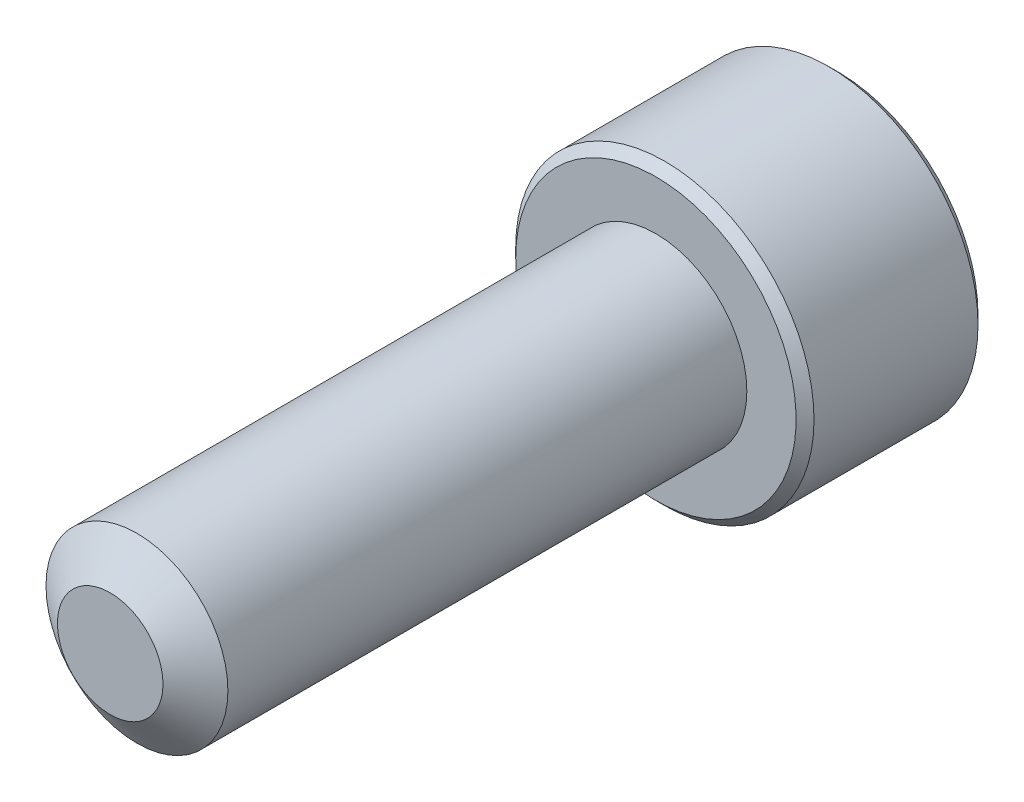
ISO-10303-21;
HEADER;
FILE_DESCRIPTION(('STEP AP214'),'2;1');
FILE_NAME('part.step','',(''),(''),'','','');
FILE_SCHEMA(('AUTOMOTIVE_DESIGN { 1 0 10303 214 1 1 1 1 }'));
ENDSEC;
DATA;
#1=APPLICATION_CONTEXT('core data for automotive mechanical design processes');
#2=APPLICATION_PROTOCOL_DEFINITION('international standard','automotive_design',2000,#1);
#3=PRODUCT_CONTEXT('',#1,'mechanical');
#4=PRODUCT('Part','Part','',(#3));
#5=PRODUCT_RELATED_PRODUCT_CATEGORY('part','',(#4));
#6=PRODUCT_DEFINITION_FORMATION('','',#4);
#7=PRODUCT_DEFINITION_CONTEXT('part definition',#1,'design');
#8=PRODUCT_DEFINITION('design','',#6,#7);
#9=PRODUCT_DEFINITION_SHAPE('','',#8);
#10=(LENGTH_UNIT() NAMED_UNIT(*) SI_UNIT(.MILLI.,.METRE.));
#11=(NAMED_UNIT(*) PLANE_ANGLE_UNIT() SI_UNIT($,.RADIAN.));
#12=(NAMED_UNIT(*) SI_UNIT($,.STERADIAN.) SOLID_ANGLE_UNIT());
#13=UNCERTAINTY_MEASURE_WITH_UNIT(LENGTH_MEASURE(1.E-05),#10,'distance_accuracy_value','');
#14=(GEOMETRIC_REPRESENTATION_CONTEXT(3) GLOBAL_UNCERTAINTY_ASSIGNED_CONTEXT((#13)) GLOBAL_UNIT_ASSIGNED_CONTEXT((#10,
#11,#12)) REPRESENTATION_CONTEXT('',''));
#15=CARTESIAN_POINT('',(0.,0.,0.));
#16=DIRECTION('',(0.,0.,1.));
#17=DIRECTION('',(1.,0.,0.));
#18=AXIS2_PLACEMENT_3D('',#15,#16,#17);
#19=CARTESIAN_POINT('',(0.,0.,-9.525));
#20=DIRECTION('',(0.,0.,1.));
#21=DIRECTION('',(1.,0.,0.));
#22=AXIS2_PLACEMENT_3D('',#19,#20,#21);
#23=CYLINDRICAL_SURFACE('',#22,1.5875);
#24=CARTESIAN_POINT('',(0.,0.,-9.525));
#25=DIRECTION('',(0.,0.,-1.));
#26=DIRECTION('',(-1.,0.,0.));
#27=AXIS2_PLACEMENT_3D('',#24,#25,#26);
#28=CIRCLE('',#27,1.5875);
#29=CARTESIAN_POINT('',(1.5875,0.,-9.525));
#30=VERTEX_POINT('',#29);
#31=EDGE_CURVE('E233',#30,#30,#28,.F.);
#32=CARTESIAN_POINT('',(0.,0.,-0.46664953170549));
#33=DIRECTION('',(0.,0.,1.));
#34=DIRECTION('',(1.,0.,0.));
#35=AXIS2_PLACEMENT_3D('',#32,#33,#34);
#36=CIRCLE('',#35,1.5875);
#37=CARTESIAN_POINT('',(1.5875,0.,-0.466649531705488));
#38=VERTEX_POINT('',#37);
#39=EDGE_CURVE('E118',#38,#38,#36,.T.);
#40=CARTESIAN_POINT('',(1.5875,0.,-9.525));
#41=CARTESIAN_POINT('',(1.5875,0.,-9.43064218262193));
#42=CARTESIAN_POINT('',(1.5875,0.,-9.33628436524386));
#43=CARTESIAN_POINT('',(1.5875,0.,-9.14756873048773));
#44=CARTESIAN_POINT('',(1.5875,0.,-9.05321091310966));
#45=CARTESIAN_POINT('',(1.5875,0.,-8.86449527835352));
#46=CARTESIAN_POINT('',(1.5875,0.,-8.77013746097546));
#47=CARTESIAN_POINT('',(1.5875,0.,-8.58142182621932));
#48=CARTESIAN_POINT('',(1.5875,0.,-8.48706400884125));
#49=CARTESIAN_POINT('',(1.5875,0.,-8.29834837408512));
#50=CARTESIAN_POINT('',(1.5875,0.,-8.20399055670705));
#51=CARTESIAN_POINT('',(1.5875,0.,-8.01527492195091));
#52=CARTESIAN_POINT('',(1.5875,0.,-7.92091710457285));
#53=CARTESIAN_POINT('',(1.5875,0.,-7.73220146981671));
#54=CARTESIAN_POINT('',(1.5875,0.,-7.63784365243864));
#55=CARTESIAN_POINT('',(1.5875,0.,-7.44912801768251));
#56=CARTESIAN_POINT('',(1.5875,0.,-7.35477020030444));
#57=CARTESIAN_POINT('',(1.5875,0.,-7.1660545655483));
#58=CARTESIAN_POINT('',(1.5875,0.,-7.07169674817024));
#59=CARTESIAN_POINT('',(1.5875,0.,-6.8829811134141));
#60=CARTESIAN_POINT('',(1.5875,0.,-6.78862329603603));
#61=CARTESIAN_POINT('',(1.5875,0.,-6.5999076612799));
#62=CARTESIAN_POINT('',(1.5875,0.,-6.50554984390183));
#63=CARTESIAN_POINT('',(1.5875,0.,-6.31683420914569));
#64=CARTESIAN_POINT('',(1.5875,0.,-6.22247639176763));
#65=CARTESIAN_POINT('',(1.5875,0.,-6.03376075701149));
#66=CARTESIAN_POINT('',(1.5875,0.,-5.93940293963342));
#67=CARTESIAN_POINT('',(1.5875,0.,-5.75068730487729));
#68=CARTESIAN_POINT('',(1.5875,0.,-5.65632948749922));
#69=CARTESIAN_POINT('',(1.5875,0.,-5.46761385274308));
#70=CARTESIAN_POINT('',(1.5875,0.,-5.37325603536502));
#71=CARTESIAN_POINT('',(1.5875,0.,-5.18454040060888));
#72=CARTESIAN_POINT('',(1.5875,0.,-5.09018258323081));
#73=CARTESIAN_POINT('',(1.5875,0.,-4.90146694847468));
#74=CARTESIAN_POINT('',(1.5875,0.,-4.80710913109661));
#75=CARTESIAN_POINT('',(1.5875,0.,-4.61839349634047));
#76=CARTESIAN_POINT('',(1.5875,0.,-4.5240356789624));
#77=CARTESIAN_POINT('',(1.5875,0.,-4.33532004420627));
#78=CARTESIAN_POINT('',(1.5875,0.,-4.2409622268282));
#79=CARTESIAN_POINT('',(1.5875,0.,-4.05224659207207));
#80=CARTESIAN_POINT('',(1.5875,0.,-3.957888774694));
#81=CARTESIAN_POINT('',(1.5875,0.,-3.76917313993786));
#82=CARTESIAN_POINT('',(1.5875,0.,-3.67481532255979));
#83=CARTESIAN_POINT('',(1.5875,0.,-3.48609968780366));
#84=CARTESIAN_POINT('',(1.5875,0.,-3.39174187042559));
#85=CARTESIAN_POINT('',(1.5875,0.,-3.20302623566946));
#86=CARTESIAN_POINT('',(1.5875,0.,-3.10866841829139));
#87=CARTESIAN_POINT('',(1.5875,0.,-2.91995278353525));
#88=CARTESIAN_POINT('',(1.5875,0.,-2.82559496615718));
#89=CARTESIAN_POINT('',(1.5875,0.,-2.63687933140105));
#90=CARTESIAN_POINT('',(1.5875,0.,-2.54252151402298));
#91=CARTESIAN_POINT('',(1.5875,0.,-2.35380587926684));
#92=CARTESIAN_POINT('',(1.5875,0.,-2.25944806188878));
#93=CARTESIAN_POINT('',(1.5875,0.,-2.07073242713264));
#94=CARTESIAN_POINT('',(1.5875,0.,-1.97637460975457));
#95=CARTESIAN_POINT('',(1.5875,0.,-1.78765897499844));
#96=CARTESIAN_POINT('',(1.5875,0.,-1.69330115762037));
#97=CARTESIAN_POINT('',(1.5875,0.,-1.50458552286423));
#98=CARTESIAN_POINT('',(1.5875,0.,-1.41022770548617));
#99=CARTESIAN_POINT('',(1.5875,0.,-1.22151207073003));
#100=CARTESIAN_POINT('',(1.5875,0.,-1.12715425335196));
#101=CARTESIAN_POINT('',(1.5875,0.,-0.938438618595827));
#102=CARTESIAN_POINT('',(1.5875,0.,-0.844080801217759));
#103=CARTESIAN_POINT('',(1.5875,0.,-0.655365166461624));
#104=CARTESIAN_POINT('',(1.5875,0.,-0.561007349083556));
#105=CARTESIAN_POINT('',(1.5875,0.,-0.466649531705488));
#106=B_SPLINE_CURVE_WITH_KNOTS('',3,(#40,#41,#42,#43,#44,#45,#46,#47,#48,#49,#50,#51,#52,#53,
#54,#55,#56,#57,#58,#59,#60,#61,#62,#63,#64,#65,#66,#67,#68,#69,#70,#71,#72,#73,#74,#75,#76,#77,
#78,#79,#80,#81,#82,#83,#84,#85,#86,#87,#88,#89,#90,#91,#92,#93,#94,#95,#96,#97,#98,#99,#100,
#101,#102,#103,#104,#105),.UNSPECIFIED.,.F.,.F.,(4,2,2,2,2,2,2,2,2,2,2,2,2,2,2,2,2,2,2,2,2,2,2,
2,2,2,2,2,2,2,2,2,4),(0.,0.283073452134203,0.566146904268407,0.84922035640261,1.13229380853681,
1.41536726067102,1.69844071280522,1.98151416493942,2.26458761707363,2.54766106920783,
2.83073452134203,3.11380797347624,3.39688142561044,3.67995487774464,3.96302832987885,
4.24610178201305,4.52917523414725,4.81224868628146,5.09532213841566,5.37839559054987,
5.66146904268407,5.94454249481827,6.22761594695248,6.51068939908668,6.79376285122088,
7.07683630335509,7.35990975548929,7.64298320762349,7.9260566597577,8.2091301118919,
8.4922035640261,8.77527701616031,9.05835046829451),.UNSPECIFIED.);
#107=EDGE_CURVE('BSEAM41',#30,#38,#106,.T.);
#108=ORIENTED_EDGE('',*,*,#31,.T.);
#109=ORIENTED_EDGE('',*,*,#39,.F.);
#110=ORIENTED_EDGE('',*,*,#107,.T.);
#111=ORIENTED_EDGE('',*,*,#107,.F.);
#112=EDGE_LOOP('',(#108,#110,#109,#111));
#113=FACE_BOUND('',#112,.T.);
#114=ADVANCED_FACE('F41',(#113),#23,.T.);
#115=CARTESIAN_POINT('',(0.,0.,0.));
#116=DIRECTION('',(0.,0.,-1.));
#117=DIRECTION('',(-1.,0.,0.));
#118=AXIS2_PLACEMENT_3D('',#115,#116,#117);
#119=CONICAL_SURFACE('',#118,0.92105540144766,0.959931088596884);
#120=ORIENTED_EDGE('',*,*,#39,.T.);
#121=EDGE_LOOP('',(#120));
#122=FACE_BOUND('',#121,.T.);
#123=CARTESIAN_POINT('',(0.,0.,0.));
#124=DIRECTION('',(0.,0.,1.));
#125=DIRECTION('',(1.,0.,0.));
#126=AXIS2_PLACEMENT_3D('',#123,#124,#125);
#127=CIRCLE('',#126,0.92105540144766);
#128=CARTESIAN_POINT('',(0.92105540144766,0.,0.));
#129=VERTEX_POINT('',#128);
#130=EDGE_CURVE('E230',#129,#129,#127,.T.);
#131=ORIENTED_EDGE('',*,*,#130,.F.);
#132=EDGE_LOOP('',(#131));
#133=FACE_BOUND('',#132,.T.);
#134=ADVANCED_FACE('F213',(#122,#133),#119,.T.);
#135=CARTESIAN_POINT('',(0.,0.,0.));
#136=DIRECTION('',(0.,0.,1.));
#137=DIRECTION('',(1.,0.,0.));
#138=AXIS2_PLACEMENT_3D('',#135,#136,#137);
#139=PLANE('',#138);
#140=ORIENTED_EDGE('',*,*,#130,.T.);
#141=EDGE_LOOP('',(#140));
#142=FACE_BOUND('',#141,.T.);
#143=ADVANCED_FACE('F210',(#142),#139,.T.);
#144=CARTESIAN_POINT('',(0.,0.,-12.7));
#145=DIRECTION('',(0.,0.,1.));
#146=DIRECTION('',(1.,0.,0.));
#147=AXIS2_PLACEMENT_3D('',#144,#145,#146);
#148=CYLINDRICAL_SURFACE('',#147,2.6035);
#149=CARTESIAN_POINT('',(0.,0.,-12.54379));
#150=DIRECTION('',(0.,0.,-1.));
#151=DIRECTION('',(-1.,0.,0.));
#152=AXIS2_PLACEMENT_3D('',#149,#150,#151);
#153=CIRCLE('',#152,2.6035);
#154=CARTESIAN_POINT('',(2.6035,0.,-12.54379));
#155=VERTEX_POINT('',#154);
#156=EDGE_CURVE('E50',#155,#155,#153,.F.);
#157=ORIENTED_EDGE('',*,*,#156,.T.);
#158=EDGE_LOOP('',(#157));
#159=FACE_BOUND('',#158,.T.);
#160=CARTESIAN_POINT('',(0.,0.,-9.68121));
#161=DIRECTION('',(0.,0.,-1.));
#162=DIRECTION('',(-1.,0.,0.));
#163=AXIS2_PLACEMENT_3D('',#160,#161,#162);
#164=CIRCLE('',#163,2.6035);
#165=CARTESIAN_POINT('',(-2.6035,0.,-9.68121));
#166=VERTEX_POINT('',#165);
#167=EDGE_CURVE('E187',#166,#166,#164,.T.);
#168=ORIENTED_EDGE('',*,*,#167,.T.);
#169=EDGE_LOOP('',(#168));
#170=FACE_BOUND('',#169,.T.);
#171=ADVANCED_FACE('F194',(#159,#170),#148,.T.);
#172=CARTESIAN_POINT('',(0.,0.,-12.7));
#173=DIRECTION('',(0.,0.,-1.));
#174=DIRECTION('',(-1.,0.,0.));
#175=AXIS2_PLACEMENT_3D('',#172,#173,#174);
#176=PLANE('',#175);
#177=CARTESIAN_POINT('',(0.,0.,-12.7));
#178=DIRECTION('',(0.,0.,-1.));
#179=DIRECTION('',(-1.,0.,0.));
#180=AXIS2_PLACEMENT_3D('',#177,#178,#179);
#181=CIRCLE('',#180,2.44729);
#182=CARTESIAN_POINT('',(2.44729,0.,-12.7));
#183=VERTEX_POINT('',#182);
#184=EDGE_CURVE('E117',#183,#183,#181,.T.);
#185=ORIENTED_EDGE('',*,*,#184,.T.);
#186=EDGE_LOOP('',(#185));
#187=FACE_BOUND('',#186,.T.);
#188=CARTESIAN_POINT('',(0.,0.,-12.7));
#189=DIRECTION('',(0.,0.,-1.));
#190=DIRECTION('',(-1.,0.,0.));
#191=AXIS2_PLACEMENT_3D('',#188,#189,#190);
#192=CIRCLE('',#191,1.3748153285078);
#193=CARTESIAN_POINT('',(-1.190625,0.687407664253902,-12.7));
#194=VERTEX_POINT('',#193);
#195=CARTESIAN_POINT('',(0.,1.3748153285078,-12.7));
#196=VERTEX_POINT('',#195);
#197=EDGE_CURVE('E96',#194,#196,#192,.T.);
#198=ORIENTED_EDGE('',*,*,#197,.F.);
#199=CARTESIAN_POINT('',(-1.190625,-0.687407664253902,-12.7));
#200=VERTEX_POINT('',#199);
#201=EDGE_CURVE('E56',#200,#194,#192,.T.);
#202=ORIENTED_EDGE('',*,*,#201,.F.);
#203=CARTESIAN_POINT('',(0.,-1.3748153285078,-12.7));
#204=VERTEX_POINT('',#203);
#205=EDGE_CURVE('E306',#204,#200,#192,.T.);
#206=ORIENTED_EDGE('',*,*,#205,.F.);
#207=CARTESIAN_POINT('',(1.190625,-0.6874076642539,-12.7));
#208=VERTEX_POINT('',#207);
#209=EDGE_CURVE('E63',#208,#204,#192,.T.);
#210=ORIENTED_EDGE('',*,*,#209,.F.);
#211=CARTESIAN_POINT('',(1.190625,0.687407664253901,-12.7));
#212=VERTEX_POINT('',#211);
#213=EDGE_CURVE('E141',#212,#208,#192,.T.);
#214=ORIENTED_EDGE('',*,*,#213,.F.);
#215=EDGE_CURVE('E106',#196,#212,#192,.T.);
#216=ORIENTED_EDGE('',*,*,#215,.F.);
#217=EDGE_LOOP('',(#198,#202,#206,#210,#214,#216));
#218=FACE_BOUND('',#217,.T.);
#219=ADVANCED_FACE('F140',(#187,#218),#176,.T.);
#220=CARTESIAN_POINT('',(0.,0.,-9.525));
#221=DIRECTION('',(0.,0.,-1.));
#222=DIRECTION('',(-1.,0.,0.));
#223=AXIS2_PLACEMENT_3D('',#220,#221,#222);
#224=PLANE('',#223);
#225=CARTESIAN_POINT('',(0.,0.,-9.525));
#226=DIRECTION('',(0.,0.,-1.));
#227=DIRECTION('',(-1.,0.,0.));
#228=AXIS2_PLACEMENT_3D('',#225,#226,#227);
#229=CIRCLE('',#228,2.44729);
#230=CARTESIAN_POINT('',(-2.44729,0.,-9.525));
#231=VERTEX_POINT('',#230);
#232=EDGE_CURVE('E11',#231,#231,#229,.F.);
#233=ORIENTED_EDGE('',*,*,#232,.T.);
#234=EDGE_LOOP('',(#233));
#235=FACE_BOUND('',#234,.T.);
#236=ORIENTED_EDGE('',*,*,#31,.F.);
#237=EDGE_LOOP('',(#236));
#238=FACE_BOUND('',#237,.T.);
#239=ADVANCED_FACE('F203',(#235,#238),#224,.F.);
#240=CARTESIAN_POINT('',(0.,0.,-12.7));
#241=DIRECTION('',(0.,0.,-1.));
#242=DIRECTION('',(-1.,0.,0.));
#243=AXIS2_PLACEMENT_3D('',#240,#241,#242);
#244=CONICAL_SURFACE('',#243,1.3748153285078,0.78539816339745);
#245=ORIENTED_EDGE('',*,*,#215,.T.);
#246=CARTESIAN_POINT('',(-0.000199999999998361,1.37493079856163,-12.7001154846));
#247=CARTESIAN_POINT('',(0.0407344195898574,1.35129730039231,-12.6764987642143));
#248=CARTESIAN_POINT('',(0.0823533883019748,1.32726857760297,-12.6542687817231));
#249=CARTESIAN_POINT('',(0.167219443673633,1.27827113768908,-12.6135656626274));
#250=CARTESIAN_POINT('',(0.210474607290961,1.25329775733078,-12.5951151826476));
#251=CARTESIAN_POINT('',(0.297696647457425,1.2029400889614,-12.5635088380043));
#252=CARTESIAN_POINT('',(0.341641294957926,1.17756863489755,-12.5502735042433));
#253=CARTESIAN_POINT('',(0.430498374163694,1.12626697629869,-12.5298814515754));
#254=CARTESIAN_POINT('',(0.475408088834755,1.10033834044413,-12.522709502896));
#255=CARTESIAN_POINT('',(0.552804127656978,1.0556537165959,-12.5162385386489));
#256=CARTESIAN_POINT('',(0.585190412515647,1.0369554863147,-12.5152803201468));
#257=CARTESIAN_POINT('',(0.64990607331777,0.99959188212981,-12.5168926490721));
#258=CARTESIAN_POINT('',(0.682235435127273,0.980926516386365,-12.5194639751796));
#259=CARTESIAN_POINT('',(0.746582156071485,0.943775919727754,-12.5279867539936));
#260=CARTESIAN_POINT('',(0.778599196336768,0.925290872911938,-12.5339413547526));
#261=CARTESIAN_POINT('',(0.842098763396457,0.888629380776601,-12.5489099640712));
#262=CARTESIAN_POINT('',(0.873581054644164,0.870453071450031,-12.5579252859121));
#263=CARTESIAN_POINT('',(0.954214838572127,0.823899134593444,-12.584682295838));
#264=CARTESIAN_POINT('',(1.00285783526766,0.79581508735709,-12.604436814436));
#265=CARTESIAN_POINT('',(1.09823941635212,0.740746505842245,-12.6489367689577));
#266=CARTESIAN_POINT('',(1.14498361758715,0.713758728676142,-12.6736659647162));
#267=CARTESIAN_POINT('',(1.190825,0.687292194200062,-12.7001154846));
#268=B_SPLINE_CURVE_WITH_KNOTS('',3,(#246,#247,#248,#249,#250,#251,#252,#253,#254,#255,#256,
#257,#258,#259,#260,#261,#262,#263,#264,#265,#266,#267),.UNSPECIFIED.,.F.,.F.,(4,2,2,2,2,2,2,2,
2,2,4),(0.,0.15862567293412,0.318176079843269,0.475191357500654,0.631811068630747,
0.743878551794716,0.855970763007027,0.96816744442324,1.08041232768376,1.25873351645467,
1.43648174479846),.UNSPECIFIED.);
#269=EDGE_CURVE('E111',#196,#212,#268,.T.);
#270=ORIENTED_EDGE('',*,*,#269,.F.);
#271=EDGE_LOOP('',(#245,#270));
#272=FACE_BOUND('',#271,.T.);
#273=ADVANCED_FACE('F112',(#272),#244,.F.);
#274=ORIENTED_EDGE('',*,*,#213,.T.);
#275=CARTESIAN_POINT('',(1.190625,-1.37097145294693,-13.1409904472899));
#276=CARTESIAN_POINT('',(1.190625,-1.3375892063789,-13.1157899888078));
#277=CARTESIAN_POINT('',(1.190625,-1.30402095496658,-13.0908366202374));
#278=CARTESIAN_POINT('',(1.190625,-1.23643692297761,-13.0415260871772));
#279=CARTESIAN_POINT('',(1.190625,-1.20242103219112,-13.0171690738994));
#280=CARTESIAN_POINT('',(1.190625,-1.09909081482554,-12.9447982089892));
#281=CARTESIAN_POINT('',(1.190625,-1.02900143506767,-12.8978726225956));
#282=CARTESIAN_POINT('',(1.190625,-0.882026737424229,-12.8057521033256));
#283=CARTESIAN_POINT('',(1.190625,-0.804981866019981,-12.7608088372421));
#284=CARTESIAN_POINT('',(1.190625,-0.647043893307966,-12.6785980245069));
#285=CARTESIAN_POINT('',(1.190625,-0.566164943702922,-12.6413046017321));
#286=CARTESIAN_POINT('',(1.190625,-0.444764933868857,-12.5956795555631));
#287=CARTESIAN_POINT('',(1.190625,-0.406041211486715,-12.5825848390215));
#288=CARTESIAN_POINT('',(1.190625,-0.327658904711934,-12.5595042758966));
#289=CARTESIAN_POINT('',(1.190625,-0.288000256118253,-12.549518643486));
#290=CARTESIAN_POINT('',(1.190625,-0.208647693212098,-12.5333412290653));
#291=CARTESIAN_POINT('',(1.190625,-0.168967240621963,-12.527084445849));
#292=CARTESIAN_POINT('',(1.190625,-0.0891819742965345,-12.5184868884185));
#293=CARTESIAN_POINT('',(1.190625,-0.0490772347013136,-12.5161454410499));
#294=CARTESIAN_POINT('',(1.190625,0.0297075773931752,-12.5155522440677));
#295=CARTESIAN_POINT('',(1.190625,0.0683866068288072,-12.517155353796));
#296=CARTESIAN_POINT('',(1.190625,0.145416876633149,-12.5240430277445));
#297=CARTESIAN_POINT('',(1.190625,0.183768052740677,-12.5293282976685));
#298=CARTESIAN_POINT('',(1.190625,0.260508634904942,-12.5433814122329));
#299=CARTESIAN_POINT('',(1.190625,0.29888705203913,-12.5522083626058));
#300=CARTESIAN_POINT('',(1.190625,0.374805334250661,-12.5728757099806));
#301=CARTESIAN_POINT('',(1.190625,0.412345269207092,-12.5847158548359));
#302=CARTESIAN_POINT('',(1.190625,0.530535580908836,-12.6264473336672));
#303=CARTESIAN_POINT('',(1.190625,0.609503725744443,-12.6610913969143));
#304=CARTESIAN_POINT('',(1.190625,0.763730269113462,-12.7381182519749));
#305=CARTESIAN_POINT('',(1.190625,0.838974064674601,-12.7805288466687));
#306=CARTESIAN_POINT('',(1.190625,0.982775796189614,-12.868025645025));
#307=CARTESIAN_POINT('',(1.190625,1.05148016607044,-12.9128741620552));
#308=CARTESIAN_POINT('',(1.190625,1.15270222256253,-12.9822053299226));
#309=CARTESIAN_POINT('',(1.190625,1.18600604145834,-13.0055601763372));
#310=CARTESIAN_POINT('',(1.190625,1.25215860362231,-13.0528875690193));
#311=CARTESIAN_POINT('',(1.190625,1.28500746868278,-13.0768599448583));
#312=CARTESIAN_POINT('',(1.190625,1.31766689427973,-13.1010883667713));
#313=B_SPLINE_CURVE_WITH_KNOTS('',3,(#275,#276,#277,#278,#279,#280,#281,#282,#283,#284,#285,
#286,#287,#288,#289,#290,#291,#292,#293,#294,#295,#296,#297,#298,#299,#300,#301,#302,#303,#304,
#305,#306,#307,#308,#309,#310,#311,#312),.UNSPECIFIED.,.F.,.F.,(4,2,2,2,2,2,2,2,2,2,2,2,2,2,2,2,
2,2,4),(0.,0.125475644763329,0.250982782413966,0.503912518769173,0.771279184643222,
1.03772598255657,1.16025581644629,1.28279408906665,1.40312855503246,1.5234423300503,
1.63939577664876,1.75537145240477,1.87336894094838,1.99135655861152,2.24929724983448,
2.50818004711562,2.75419821472196,2.87622362118596,2.9982157038896),.UNSPECIFIED.);
#314=EDGE_CURVE('E105',#212,#208,#313,.F.);
#315=ORIENTED_EDGE('',*,*,#314,.F.);
#316=EDGE_LOOP('',(#274,#315));
#317=FACE_BOUND('',#316,.T.);
#318=ADVANCED_FACE('F317',(#317),#244,.F.);
#319=ORIENTED_EDGE('',*,*,#209,.T.);
#320=CARTESIAN_POINT('',(1.190825,-0.687292194200062,-12.7001154846));
#321=CARTESIAN_POINT('',(1.14989058041014,-0.710925692369387,-12.6764987642143));
#322=CARTESIAN_POINT('',(1.10827161169802,-0.734954415158722,-12.6542687817231));
#323=CARTESIAN_POINT('',(1.02340555632637,-0.783951855072611,-12.6135656626274));
#324=CARTESIAN_POINT('',(0.980150392709038,-0.808925235430917,-12.5951151826476));
#325=CARTESIAN_POINT('',(0.892928352542574,-0.859282903800292,-12.5635088380043));
#326=CARTESIAN_POINT('',(0.848983705042073,-0.88465435786415,-12.5502735042433));
#327=CARTESIAN_POINT('',(0.760126625836305,-0.935956016463004,-12.5298814515754));
#328=CARTESIAN_POINT('',(0.715216911165244,-0.96188465231757,-12.522709502896));
#329=CARTESIAN_POINT('',(0.637820872343021,-1.00656927616579,-12.5162385386489));
#330=CARTESIAN_POINT('',(0.605434587484353,-1.025267506447,-12.5152803201468));
#331=CARTESIAN_POINT('',(0.54071892668223,-1.06263111063189,-12.5168926490721));
#332=CARTESIAN_POINT('',(0.508389564872727,-1.08129647637533,-12.5194639751796));
#333=CARTESIAN_POINT('',(0.444042843928515,-1.11844707303394,-12.5279867539936));
#334=CARTESIAN_POINT('',(0.412025803663232,-1.13693211984976,-12.5339413547526));
#335=CARTESIAN_POINT('',(0.348526236603542,-1.17359361198509,-12.5489099640712));
#336=CARTESIAN_POINT('',(0.317043945355835,-1.19176992131166,-12.5579252859121));
#337=CARTESIAN_POINT('',(0.236410161427873,-1.23832385816825,-12.584682295838));
#338=CARTESIAN_POINT('',(0.187767164732342,-1.26640790540461,-12.604436814436));
#339=CARTESIAN_POINT('',(0.0923855836478808,-1.32147648691945,-12.6489367689577));
#340=CARTESIAN_POINT('',(0.0456413824128441,-1.34846426408556,-12.6736659647162));
#341=CARTESIAN_POINT('',(-0.00020000000000049,-1.37493079856164,-12.7001154846));
#342=B_SPLINE_CURVE_WITH_KNOTS('',3,(#320,#321,#322,#323,#324,#325,#326,#327,#328,#329,#330,
#331,#332,#333,#334,#335,#336,#337,#338,#339,#340,#341),.UNSPECIFIED.,.F.,.F.,(4,2,2,2,2,2,2,2,
2,2,4),(0.,0.15862567293412,0.31817607984327,0.475191357500654,0.631811068630746,
0.743878551794716,0.855970763007027,0.96816744442324,1.08041232768376,1.25873351645467,
1.43648174479847),.UNSPECIFIED.);
#343=EDGE_CURVE('E154',#208,#204,#342,.T.);
#344=ORIENTED_EDGE('',*,*,#343,.F.);
#345=EDGE_LOOP('',(#319,#344));
#346=FACE_BOUND('',#345,.T.);
#347=ADVANCED_FACE('F314',(#346),#244,.F.);
#348=ORIENTED_EDGE('',*,*,#205,.T.);
#349=CARTESIAN_POINT('',(0.000199999999999274,-1.37493079856164,-12.7001154846));
#350=CARTESIAN_POINT('',(-0.0407344195898569,-1.35129730039231,-12.6764987642143));
#351=CARTESIAN_POINT('',(-0.0823533883019743,-1.32726857760298,-12.6542687817231));
#352=CARTESIAN_POINT('',(-0.167219443673633,-1.27827113768909,-12.6135656626274));
#353=CARTESIAN_POINT('',(-0.210474607290961,-1.25329775733078,-12.5951151826476));
#354=CARTESIAN_POINT('',(-0.297696647457425,-1.20294008896141,-12.5635088380043));
#355=CARTESIAN_POINT('',(-0.341641294957926,-1.17756863489755,-12.5502735042433));
#356=CARTESIAN_POINT('',(-0.430498374163694,-1.12626697629869,-12.5298814515754));
#357=CARTESIAN_POINT('',(-0.475408088834756,-1.10033834044413,-12.522709502896));
#358=CARTESIAN_POINT('',(-0.55280412765698,-1.05565371659591,-12.5162385386489));
#359=CARTESIAN_POINT('',(-0.585190412515648,-1.0369554863147,-12.5152803201468));
#360=CARTESIAN_POINT('',(-0.649906073317771,-0.99959188212981,-12.5168926490721));
#361=CARTESIAN_POINT('',(-0.682235435127274,-0.980926516386365,-12.5194639751796));
#362=CARTESIAN_POINT('',(-0.746582156071486,-0.943775919727755,-12.5279867539936));
#363=CARTESIAN_POINT('',(-0.77859919633677,-0.925290872911938,-12.5339413547526));
#364=CARTESIAN_POINT('',(-0.842098763396459,-0.888629380776602,-12.5489099640712));
#365=CARTESIAN_POINT('',(-0.873581054644166,-0.870453071450032,-12.5579252859121));
#366=CARTESIAN_POINT('',(-0.954214838572127,-0.823899134593445,-12.584682295838));
#367=CARTESIAN_POINT('',(-1.00285783526766,-0.795815087357091,-12.604436814436));
#368=CARTESIAN_POINT('',(-1.09823941635212,-0.740746505842247,-12.6489367689577));
#369=CARTESIAN_POINT('',(-1.14498361758715,-0.713758728676145,-12.6736659647162));
#370=CARTESIAN_POINT('',(-1.190825,-0.687292194200065,-12.7001154846));
#371=B_SPLINE_CURVE_WITH_KNOTS('',3,(#349,#350,#351,#352,#353,#354,#355,#356,#357,#358,#359,
#360,#361,#362,#363,#364,#365,#366,#367,#368,#369,#370),.UNSPECIFIED.,.F.,.F.,(4,2,2,2,2,2,2,2,
2,2,4),(0.,0.158625672934119,0.31817607984327,0.475191357500655,0.631811068630749,
0.743878551794719,0.85597076300703,0.968167444423243,1.08041232768377,1.25873351645467,
1.43648174479846),.UNSPECIFIED.);
#372=EDGE_CURVE('E283',#204,#200,#371,.T.);
#373=ORIENTED_EDGE('',*,*,#372,.F.);
#374=EDGE_LOOP('',(#348,#373));
#375=FACE_BOUND('',#374,.T.);
#376=ADVANCED_FACE('F311',(#375),#244,.F.);
#377=ORIENTED_EDGE('',*,*,#201,.T.);
#378=CARTESIAN_POINT('',(-1.190625,-1.37097145294694,-13.1409904472899));
#379=CARTESIAN_POINT('',(-1.190625,-1.33758920637891,-13.1157899888078));
#380=CARTESIAN_POINT('',(-1.190625,-1.30402095496659,-13.0908366202375));
#381=CARTESIAN_POINT('',(-1.190625,-1.23643692297762,-13.0415260871772));
#382=CARTESIAN_POINT('',(-1.190625,-1.20242103219113,-13.0171690738994));
#383=CARTESIAN_POINT('',(-1.190625,-1.09909081482555,-12.9447982089892));
#384=CARTESIAN_POINT('',(-1.190625,-1.02900143506767,-12.8978726225956));
#385=CARTESIAN_POINT('',(-1.190625,-0.882026737424234,-12.8057521033256));
#386=CARTESIAN_POINT('',(-1.190625,-0.804981866019986,-12.7608088372421));
#387=CARTESIAN_POINT('',(-1.190625,-0.647043893307969,-12.6785980245069));
#388=CARTESIAN_POINT('',(-1.190625,-0.566164943702924,-12.6413046017321));
#389=CARTESIAN_POINT('',(-1.190625,-0.444764933868859,-12.5956795555631));
#390=CARTESIAN_POINT('',(-1.190625,-0.406041211486716,-12.5825848390215));
#391=CARTESIAN_POINT('',(-1.190625,-0.327658904711936,-12.5595042758966));
#392=CARTESIAN_POINT('',(-1.190625,-0.288000256118255,-12.549518643486));
#393=CARTESIAN_POINT('',(-1.190625,-0.208647693212099,-12.5333412290653));
#394=CARTESIAN_POINT('',(-1.190625,-0.168967240621964,-12.527084445849));
#395=CARTESIAN_POINT('',(-1.190625,-0.0891819742965357,-12.5184868884185));
#396=CARTESIAN_POINT('',(-1.190625,-0.0490772347013147,-12.5161454410499));
#397=CARTESIAN_POINT('',(-1.190625,0.0297075773931742,-12.5155522440676));
#398=CARTESIAN_POINT('',(-1.190625,0.0683866068288064,-12.517155353796));
#399=CARTESIAN_POINT('',(-1.190625,0.145416876633148,-12.5240430277445));
#400=CARTESIAN_POINT('',(-1.190625,0.183768052740676,-12.5293282976685));
#401=CARTESIAN_POINT('',(-1.190625,0.260508634904942,-12.5433814122329));
#402=CARTESIAN_POINT('',(-1.190625,0.29888705203913,-12.5522083626058));
#403=CARTESIAN_POINT('',(-1.190625,0.374805334250661,-12.5728757099806));
#404=CARTESIAN_POINT('',(-1.190625,0.412345269207092,-12.5847158548359));
#405=CARTESIAN_POINT('',(-1.190625,0.530535580908837,-12.6264473336672));
#406=CARTESIAN_POINT('',(-1.190625,0.609503725744445,-12.6610913969143));
#407=CARTESIAN_POINT('',(-1.190625,0.763730269113464,-12.7381182519749));
#408=CARTESIAN_POINT('',(-1.190625,0.838974064674603,-12.7805288466687));
#409=CARTESIAN_POINT('',(-1.190625,0.982775796189615,-12.868025645025));
#410=CARTESIAN_POINT('',(-1.190625,1.05148016607044,-12.9128741620552));
#411=CARTESIAN_POINT('',(-1.190625,1.15270222256253,-12.9822053299226));
#412=CARTESIAN_POINT('',(-1.190625,1.18600604145833,-13.0055601763372));
#413=CARTESIAN_POINT('',(-1.190625,1.25215860362231,-13.0528875690193));
#414=CARTESIAN_POINT('',(-1.190625,1.28500746868278,-13.0768599448583));
#415=CARTESIAN_POINT('',(-1.190625,1.31766689427973,-13.1010883667712));
#416=B_SPLINE_CURVE_WITH_KNOTS('',3,(#378,#379,#380,#381,#382,#383,#384,#385,#386,#387,#388,
#389,#390,#391,#392,#393,#394,#395,#396,#397,#398,#399,#400,#401,#402,#403,#404,#405,#406,#407,
#408,#409,#410,#411,#412,#413,#414,#415),.UNSPECIFIED.,.F.,.F.,(4,2,2,2,2,2,2,2,2,2,2,2,2,2,2,2,
2,2,4),(0.,0.12547564476333,0.250982782413968,0.503912518769176,0.771279184643229,
1.03772598255658,1.1602558164463,1.28279408906666,1.40312855503247,1.5234423300503,
1.63939577664877,1.75537145240478,1.87336894094839,1.99135655861153,2.2492972498345,
2.50818004711564,2.75419821472197,2.87622362118597,2.99821570388961),.UNSPECIFIED.);
#417=EDGE_CURVE('E129',#200,#194,#416,.T.);
#418=ORIENTED_EDGE('',*,*,#417,.F.);
#419=EDGE_LOOP('',(#377,#418));
#420=FACE_BOUND('',#419,.T.);
#421=ADVANCED_FACE('F326',(#420),#244,.F.);
#422=ORIENTED_EDGE('',*,*,#197,.T.);
#423=CARTESIAN_POINT('',(-1.190825,0.687292194200061,-12.7001154846));
#424=CARTESIAN_POINT('',(-1.14989058041014,0.710925692369386,-12.6764987642143));
#425=CARTESIAN_POINT('',(-1.10827161169802,0.734954415158721,-12.6542687817231));
#426=CARTESIAN_POINT('',(-1.02340555632636,0.78395185507261,-12.6135656626274));
#427=CARTESIAN_POINT('',(-0.980150392709036,0.808925235430915,-12.5951151826475));
#428=CARTESIAN_POINT('',(-0.892928352542572,0.859282903800291,-12.5635088380043));
#429=CARTESIAN_POINT('',(-0.848983705042072,0.884654357864149,-12.5502735042433));
#430=CARTESIAN_POINT('',(-0.760126625836303,0.935956016463003,-12.5298814515754));
#431=CARTESIAN_POINT('',(-0.715216911165242,0.96188465231757,-12.522709502896));
#432=CARTESIAN_POINT('',(-0.637820872343018,1.00656927616579,-12.5162385386489));
#433=CARTESIAN_POINT('',(-0.60543458748435,1.02526750644699,-12.5152803201468));
#434=CARTESIAN_POINT('',(-0.540718926682227,1.06263111063189,-12.5168926490721));
#435=CARTESIAN_POINT('',(-0.508389564872724,1.08129647637533,-12.5194639751796));
#436=CARTESIAN_POINT('',(-0.444042843928512,1.11844707303394,-12.5279867539936));
#437=CARTESIAN_POINT('',(-0.412025803663229,1.13693211984976,-12.5339413547526));
#438=CARTESIAN_POINT('',(-0.34852623660354,1.17359361198509,-12.5489099640712));
#439=CARTESIAN_POINT('',(-0.317043945355833,1.19176992131166,-12.5579252859121));
#440=CARTESIAN_POINT('',(-0.23641016142787,1.23832385816825,-12.584682295838));
#441=CARTESIAN_POINT('',(-0.18776716473234,1.2664079054046,-12.604436814436));
#442=CARTESIAN_POINT('',(-0.0923855836478795,1.32147648691945,-12.6489367689577));
#443=CARTESIAN_POINT('',(-0.0456413824128431,1.34846426408555,-12.6736659647162));
#444=CARTESIAN_POINT('',(0.000200000000001581,1.37493079856163,-12.7001154846));
#445=B_SPLINE_CURVE_WITH_KNOTS('',3,(#423,#424,#425,#426,#427,#428,#429,#430,#431,#432,#433,
#434,#435,#436,#437,#438,#439,#440,#441,#442,#443,#444),.UNSPECIFIED.,.F.,.F.,(4,2,2,2,2,2,2,2,
2,2,4),(0.,0.15862567293412,0.31817607984327,0.475191357500654,0.631811068630747,
0.743878551794717,0.855970763007028,0.96816744442324,1.08041232768376,1.25873351645467,
1.43648174479846),.UNSPECIFIED.);
#446=EDGE_CURVE('E100',#194,#196,#445,.T.);
#447=ORIENTED_EDGE('',*,*,#446,.F.);
#448=EDGE_LOOP('',(#422,#447));
#449=FACE_BOUND('',#448,.T.);
#450=ADVANCED_FACE('F98',(#449),#244,.F.);
#451=CARTESIAN_POINT('',(-1.190625,0.687407664253899,-10.9140625));
#452=DIRECTION('',(0.,0.,1.));
#453=DIRECTION('',(1.,0.,0.));
#454=AXIS2_PLACEMENT_3D('',#451,#452,#453);
#455=PLANE('',#454);
#456=DIRECTION('',(0.866025403784439,0.5,0.));
#457=VECTOR('',#456,1.);
#458=CARTESIAN_POINT('',(-1.190625,0.687407664253899,-10.9140625));
#459=LINE('',#458,#457);
#460=CARTESIAN_POINT('',(-1.190625,0.687407664253899,-10.9140625));
#461=VERTEX_POINT('',#460);
#462=CARTESIAN_POINT('',(0.,1.3748153285078,-10.9140625));
#463=VERTEX_POINT('',#462);
#464=EDGE_CURVE('E128',#461,#463,#459,.T.);
#465=ORIENTED_EDGE('',*,*,#464,.T.);
#466=DIRECTION('',(0.866025403784439,-0.499999999999999,0.));
#467=VECTOR('',#466,1.);
#468=CARTESIAN_POINT('',(0.,1.3748153285078,-10.9140625));
#469=LINE('',#468,#467);
#470=CARTESIAN_POINT('',(1.190625,0.687407664253899,-10.9140625));
#471=VERTEX_POINT('',#470);
#472=EDGE_CURVE('E133',#463,#471,#469,.T.);
#473=ORIENTED_EDGE('',*,*,#472,.T.);
#474=DIRECTION('',(0.,-1.,0.));
#475=VECTOR('',#474,1.);
#476=CARTESIAN_POINT('',(1.190625,0.687407664253899,-10.9140625));
#477=LINE('',#476,#475);
#478=CARTESIAN_POINT('',(1.190625,-0.687407664253899,-10.9140625));
#479=VERTEX_POINT('',#478);
#480=EDGE_CURVE('E265',#471,#479,#477,.T.);
#481=ORIENTED_EDGE('',*,*,#480,.T.);
#482=DIRECTION('',(-0.866025403784438,-0.500000000000001,0.));
#483=VECTOR('',#482,1.);
#484=CARTESIAN_POINT('',(1.190625,-0.687407664253899,-10.9140625));
#485=LINE('',#484,#483);
#486=CARTESIAN_POINT('',(0.,-1.3748153285078,-10.9140625));
#487=VERTEX_POINT('',#486);
#488=EDGE_CURVE('E261',#479,#487,#485,.T.);
#489=ORIENTED_EDGE('',*,*,#488,.T.);
#490=DIRECTION('',(-0.866025403784439,0.5,0.));
#491=VECTOR('',#490,1.);
#492=CARTESIAN_POINT('',(0.,-1.3748153285078,-10.9140625));
#493=LINE('',#492,#491);
#494=CARTESIAN_POINT('',(-1.190625,-0.687407664253902,-10.9140625));
#495=VERTEX_POINT('',#494);
#496=EDGE_CURVE('E257',#487,#495,#493,.T.);
#497=ORIENTED_EDGE('',*,*,#496,.T.);
#498=DIRECTION('',(0.,1.,0.));
#499=VECTOR('',#498,1.);
#500=CARTESIAN_POINT('',(-1.190625,-0.687407664253902,-10.9140625));
#501=LINE('',#500,#499);
#502=EDGE_CURVE('E137',#495,#461,#501,.T.);
#503=ORIENTED_EDGE('',*,*,#502,.T.);
#504=EDGE_LOOP('',(#465,#473,#481,#489,#497,#503));
#505=FACE_BOUND('',#504,.T.);
#506=ADVANCED_FACE('F174',(#505),#455,.F.);
#507=CARTESIAN_POINT('',(0.,1.3748153285078,-10.9140625));
#508=DIRECTION('',(0.499999999999999,0.866025403784439,0.));
#509=DIRECTION('',(-0.866025403784439,0.5,0.));
#510=AXIS2_PLACEMENT_3D('',#507,#508,#509);
#511=PLANE('',#510);
#512=DIRECTION('',(0.,0.,-1.));
#513=VECTOR('',#512,1.);
#514=CARTESIAN_POINT('',(0.,1.3748153285078,-10.9140625));
#515=LINE('',#514,#513);
#516=EDGE_CURVE('E124',#463,#196,#515,.T.);
#517=ORIENTED_EDGE('',*,*,#516,.T.);
#518=ORIENTED_EDGE('',*,*,#269,.T.);
#519=DIRECTION('',(0.,0.,-1.));
#520=VECTOR('',#519,1.);
#521=CARTESIAN_POINT('',(1.190625,0.687407664253899,-10.9140625));
#522=LINE('',#521,#520);
#523=EDGE_CURVE('E136',#471,#212,#522,.T.);
#524=ORIENTED_EDGE('',*,*,#523,.F.);
#525=ORIENTED_EDGE('',*,*,#472,.F.);
#526=EDGE_LOOP('',(#517,#518,#524,#525));
#527=FACE_BOUND('',#526,.T.);
#528=ADVANCED_FACE('F131',(#527),#511,.F.);
#529=CARTESIAN_POINT('',(1.190625,0.687407664253899,-10.9140625));
#530=DIRECTION('',(1.,0.,0.));
#531=DIRECTION('',(0.,1.,0.));
#532=AXIS2_PLACEMENT_3D('',#529,#530,#531);
#533=PLANE('',#532);
#534=ORIENTED_EDGE('',*,*,#523,.T.);
#535=ORIENTED_EDGE('',*,*,#314,.T.);
#536=DIRECTION('',(0.,0.,-1.));
#537=VECTOR('',#536,1.);
#538=CARTESIAN_POINT('',(1.190625,-0.687407664253899,-10.9140625));
#539=LINE('',#538,#537);
#540=EDGE_CURVE('E241',#479,#208,#539,.T.);
#541=ORIENTED_EDGE('',*,*,#540,.F.);
#542=ORIENTED_EDGE('',*,*,#480,.F.);
#543=EDGE_LOOP('',(#534,#535,#541,#542));
#544=FACE_BOUND('',#543,.T.);
#545=ADVANCED_FACE('F163',(#544),#533,.F.);
#546=CARTESIAN_POINT('',(1.190625,-0.687407664253899,-10.9140625));
#547=DIRECTION('',(0.500000000000001,-0.866025403784438,0.));
#548=DIRECTION('',(0.866025403784438,0.500000000000001,0.));
#549=AXIS2_PLACEMENT_3D('',#546,#547,#548);
#550=PLANE('',#549);
#551=ORIENTED_EDGE('',*,*,#540,.T.);
#552=ORIENTED_EDGE('',*,*,#343,.T.);
#553=DIRECTION('',(0.,0.,-1.));
#554=VECTOR('',#553,1.);
#555=CARTESIAN_POINT('',(0.,-1.3748153285078,-10.9140625));
#556=LINE('',#555,#554);
#557=EDGE_CURVE('E245',#487,#204,#556,.T.);
#558=ORIENTED_EDGE('',*,*,#557,.F.);
#559=ORIENTED_EDGE('',*,*,#488,.F.);
#560=EDGE_LOOP('',(#551,#552,#558,#559));
#561=FACE_BOUND('',#560,.T.);
#562=ADVANCED_FACE('F167',(#561),#550,.F.);
#563=CARTESIAN_POINT('',(0.,-1.3748153285078,-10.9140625));
#564=DIRECTION('',(-0.5,-0.866025403784439,0.));
#565=DIRECTION('',(0.866025403784439,-0.5,0.));
#566=AXIS2_PLACEMENT_3D('',#563,#564,#565);
#567=PLANE('',#566);
#568=ORIENTED_EDGE('',*,*,#557,.T.);
#569=ORIENTED_EDGE('',*,*,#372,.T.);
#570=DIRECTION('',(0.,0.,-1.));
#571=VECTOR('',#570,1.);
#572=CARTESIAN_POINT('',(-1.190625,-0.687407664253902,-10.9140625));
#573=LINE('',#572,#571);
#574=EDGE_CURVE('E249',#495,#200,#573,.T.);
#575=ORIENTED_EDGE('',*,*,#574,.F.);
#576=ORIENTED_EDGE('',*,*,#496,.F.);
#577=EDGE_LOOP('',(#568,#569,#575,#576));
#578=FACE_BOUND('',#577,.T.);
#579=ADVANCED_FACE('F291',(#578),#567,.F.);
#580=CARTESIAN_POINT('',(-1.190625,-0.687407664253902,-10.9140625));
#581=DIRECTION('',(-1.,0.,0.));
#582=DIRECTION('',(0.,0.,1.));
#583=AXIS2_PLACEMENT_3D('',#580,#581,#582);
#584=PLANE('',#583);
#585=ORIENTED_EDGE('',*,*,#574,.T.);
#586=ORIENTED_EDGE('',*,*,#417,.T.);
#587=DIRECTION('',(0.,0.,-1.));
#588=VECTOR('',#587,1.);
#589=CARTESIAN_POINT('',(-1.190625,0.687407664253899,-10.9140625));
#590=LINE('',#589,#588);
#591=EDGE_CURVE('E126',#461,#194,#590,.T.);
#592=ORIENTED_EDGE('',*,*,#591,.F.);
#593=ORIENTED_EDGE('',*,*,#502,.F.);
#594=EDGE_LOOP('',(#585,#586,#592,#593));
#595=FACE_BOUND('',#594,.T.);
#596=ADVANCED_FACE('F288',(#595),#584,.F.);
#597=CARTESIAN_POINT('',(-1.190625,0.687407664253899,-10.9140625));
#598=DIRECTION('',(-0.5,0.866025403784439,0.));
#599=DIRECTION('',(-0.866025403784439,-0.5,0.));
#600=AXIS2_PLACEMENT_3D('',#597,#598,#599);
#601=PLANE('',#600);
#602=ORIENTED_EDGE('',*,*,#591,.T.);
#603=ORIENTED_EDGE('',*,*,#446,.T.);
#604=ORIENTED_EDGE('',*,*,#516,.F.);
#605=ORIENTED_EDGE('',*,*,#464,.F.);
#606=EDGE_LOOP('',(#602,#603,#604,#605));
#607=FACE_BOUND('',#606,.T.);
#608=ADVANCED_FACE('F122',(#607),#601,.F.);
#609=CARTESIAN_POINT('',(0.,0.,-12.7));
#610=DIRECTION('',(0.,0.,1.));
#611=DIRECTION('',(1.,0.,0.));
#612=AXIS2_PLACEMENT_3D('',#609,#610,#611);
#613=CONICAL_SURFACE('',#612,2.44729,0.785398163397448);
#614=CARTESIAN_POINT('',(2.6035,0.,-12.54379));
#615=CARTESIAN_POINT('',(2.6018728125,0.,-12.5454171875));
#616=CARTESIAN_POINT('',(2.600245625,0.,-12.547044375));
#617=CARTESIAN_POINT('',(2.59699125,0.,-12.55029875));
#618=CARTESIAN_POINT('',(2.5953640625,0.,-12.5519259375));
#619=CARTESIAN_POINT('',(2.5921096875,0.,-12.5551803125));
#620=CARTESIAN_POINT('',(2.5904825,0.,-12.5568075));
#621=CARTESIAN_POINT('',(2.587228125,0.,-12.560061875));
#622=CARTESIAN_POINT('',(2.5856009375,0.,-12.5616890625));
#623=CARTESIAN_POINT('',(2.5823465625,0.,-12.5649434375));
#624=CARTESIAN_POINT('',(2.580719375,0.,-12.566570625));
#625=CARTESIAN_POINT('',(2.577465,0.,-12.569825));
#626=CARTESIAN_POINT('',(2.5758378125,0.,-12.5714521875));
#627=CARTESIAN_POINT('',(2.5725834375,0.,-12.5747065625));
#628=CARTESIAN_POINT('',(2.57095625,0.,-12.57633375));
#629=CARTESIAN_POINT('',(2.567701875,0.,-12.579588125));
#630=CARTESIAN_POINT('',(2.5660746875,0.,-12.5812153125));
#631=CARTESIAN_POINT('',(2.5628203125,0.,-12.5844696875));
#632=CARTESIAN_POINT('',(2.561193125,0.,-12.586096875));
#633=CARTESIAN_POINT('',(2.55793875,0.,-12.58935125));
#634=CARTESIAN_POINT('',(2.5563115625,0.,-12.5909784375));
#635=CARTESIAN_POINT('',(2.5530571875,0.,-12.5942328125));
#636=CARTESIAN_POINT('',(2.55143,0.,-12.59586));
#637=CARTESIAN_POINT('',(2.548175625,0.,-12.599114375));
#638=CARTESIAN_POINT('',(2.5465484375,0.,-12.6007415625));
#639=CARTESIAN_POINT('',(2.5432940625,0.,-12.6039959375));
#640=CARTESIAN_POINT('',(2.541666875,0.,-12.605623125));
#641=CARTESIAN_POINT('',(2.5384125,0.,-12.6088775));
#642=CARTESIAN_POINT('',(2.5367853125,0.,-12.6105046875));
#643=CARTESIAN_POINT('',(2.5335309375,0.,-12.6137590625));
#644=CARTESIAN_POINT('',(2.53190375,0.,-12.61538625));
#645=CARTESIAN_POINT('',(2.528649375,0.,-12.618640625));
#646=CARTESIAN_POINT('',(2.5270221875,0.,-12.6202678125));
#647=CARTESIAN_POINT('',(2.5237678125,0.,-12.6235221875));
#648=CARTESIAN_POINT('',(2.522140625,0.,-12.625149375));
#649=CARTESIAN_POINT('',(2.51888625,0.,-12.62840375));
#650=CARTESIAN_POINT('',(2.5172590625,0.,-12.6300309375));
#651=CARTESIAN_POINT('',(2.5140046875,0.,-12.6332853125));
#652=CARTESIAN_POINT('',(2.5123775,0.,-12.6349125));
#653=CARTESIAN_POINT('',(2.509123125,0.,-12.638166875));
#654=CARTESIAN_POINT('',(2.5074959375,0.,-12.6397940625));
#655=CARTESIAN_POINT('',(2.5042415625,0.,-12.6430484375));
#656=CARTESIAN_POINT('',(2.502614375,0.,-12.644675625));
#657=CARTESIAN_POINT('',(2.49936,0.,-12.64793));
#658=CARTESIAN_POINT('',(2.4977328125,0.,-12.6495571875));
#659=CARTESIAN_POINT('',(2.4944784375,0.,-12.6528115625));
#660=CARTESIAN_POINT('',(2.49285125,0.,-12.65443875));
#661=CARTESIAN_POINT('',(2.489596875,0.,-12.657693125));
#662=CARTESIAN_POINT('',(2.4879696875,0.,-12.6593203125));
#663=CARTESIAN_POINT('',(2.4847153125,0.,-12.6625746875));
#664=CARTESIAN_POINT('',(2.483088125,0.,-12.664201875));
#665=CARTESIAN_POINT('',(2.47983375,0.,-12.66745625));
#666=CARTESIAN_POINT('',(2.4782065625,0.,-12.6690834375));
#667=CARTESIAN_POINT('',(2.4749521875,0.,-12.6723378125));
#668=CARTESIAN_POINT('',(2.473325,0.,-12.673965));
#669=CARTESIAN_POINT('',(2.470070625,0.,-12.677219375));
#670=CARTESIAN_POINT('',(2.4684434375,0.,-12.6788465625));
#671=CARTESIAN_POINT('',(2.4651890625,0.,-12.6821009375));
#672=CARTESIAN_POINT('',(2.463561875,0.,-12.683728125));
#673=CARTESIAN_POINT('',(2.4603075,0.,-12.6869825));
#674=CARTESIAN_POINT('',(2.4586803125,0.,-12.6886096875));
#675=CARTESIAN_POINT('',(2.4554259375,0.,-12.6918640625));
#676=CARTESIAN_POINT('',(2.45379875,0.,-12.69349125));
#677=CARTESIAN_POINT('',(2.450544375,0.,-12.696745625));
#678=CARTESIAN_POINT('',(2.4489171875,0.,-12.6983728125));
#679=CARTESIAN_POINT('',(2.44729,0.,-12.7));
#680=B_SPLINE_CURVE_WITH_KNOTS('',3,(#614,#615,#616,#617,#618,#619,#620,#621,#622,#623,#624,
#625,#626,#627,#628,#629,#630,#631,#632,#633,#634,#635,#636,#637,#638,#639,#640,#641,#642,#643,
#644,#645,#646,#647,#648,#649,#650,#651,#652,#653,#654,#655,#656,#657,#658,#659,#660,#661,#662,
#663,#664,#665,#666,#667,#668,#669,#670,#671,#672,#673,#674,#675,#676,#677,#678,#679),
.UNSPECIFIED.,.F.,.F.,(4,2,2,2,2,2,2,2,2,2,2,2,2,2,2,2,2,2,2,2,2,2,2,2,2,2,2,2,2,2,2,2,4),(0.,
0.006903571893073,0.0138071437861445,0.0207107156792162,0.027614287572288,0.0345178594653598,
0.0414214313584325,0.0483250032515043,0.055228575144576,0.0621321470376478,0.0690357189307193,
0.0759392908237923,0.0828428627168641,0.0897464346099358,0.0966500065030073,0.103553578396079,
0.110457150289151,0.117360722182224,0.124264294075295,0.131167865968367,0.138071437861439,
0.144975009754511,0.151878581647583,0.158782153540655,0.165685725433727,0.172589297326799,
0.17949286921987,0.186396441112943,0.193300013006015,0.200203584899087,0.207107156792158,
0.21401072868523,0.220914300578303),.UNSPECIFIED.);
#681=EDGE_CURVE('BSEAM197',#155,#183,#680,.T.);
#682=ORIENTED_EDGE('',*,*,#156,.F.);
#683=ORIENTED_EDGE('',*,*,#184,.F.);
#684=ORIENTED_EDGE('',*,*,#681,.T.);
#685=ORIENTED_EDGE('',*,*,#681,.F.);
#686=EDGE_LOOP('',(#682,#684,#683,#685));
#687=FACE_BOUND('',#686,.T.);
#688=ADVANCED_FACE('F197',(#687),#613,.T.);
#689=CARTESIAN_POINT('',(0.,0.,-9.68121));
#690=DIRECTION('',(0.,0.,-1.));
#691=DIRECTION('',(-1.,0.,0.));
#692=AXIS2_PLACEMENT_3D('',#689,#690,#691);
#693=CONICAL_SURFACE('',#692,2.6035,0.785398163397448);
#694=ORIENTED_EDGE('',*,*,#232,.F.);
#695=EDGE_LOOP('',(#694));
#696=FACE_BOUND('',#695,.T.);
#697=ORIENTED_EDGE('',*,*,#167,.F.);
#698=EDGE_LOOP('',(#697));
#699=FACE_BOUND('',#698,.T.);
#700=ADVANCED_FACE('F43',(#696,#699),#693,.T.);
#701=CLOSED_SHELL('',(#114,#134,#143,#171,#219,#239,#273,#318,#347,#376,#421,#450,#506,#528,
#545,#562,#579,#596,#608,#688,#700));
#702=MANIFOLD_SOLID_BREP('B2',#701);
#703=ADVANCED_BREP_SHAPE_REPRESENTATION('',(#18,#702),#14);
#704=SHAPE_DEFINITION_REPRESENTATION(#9,#703);
ENDSEC;
END-ISO-10303-21;
